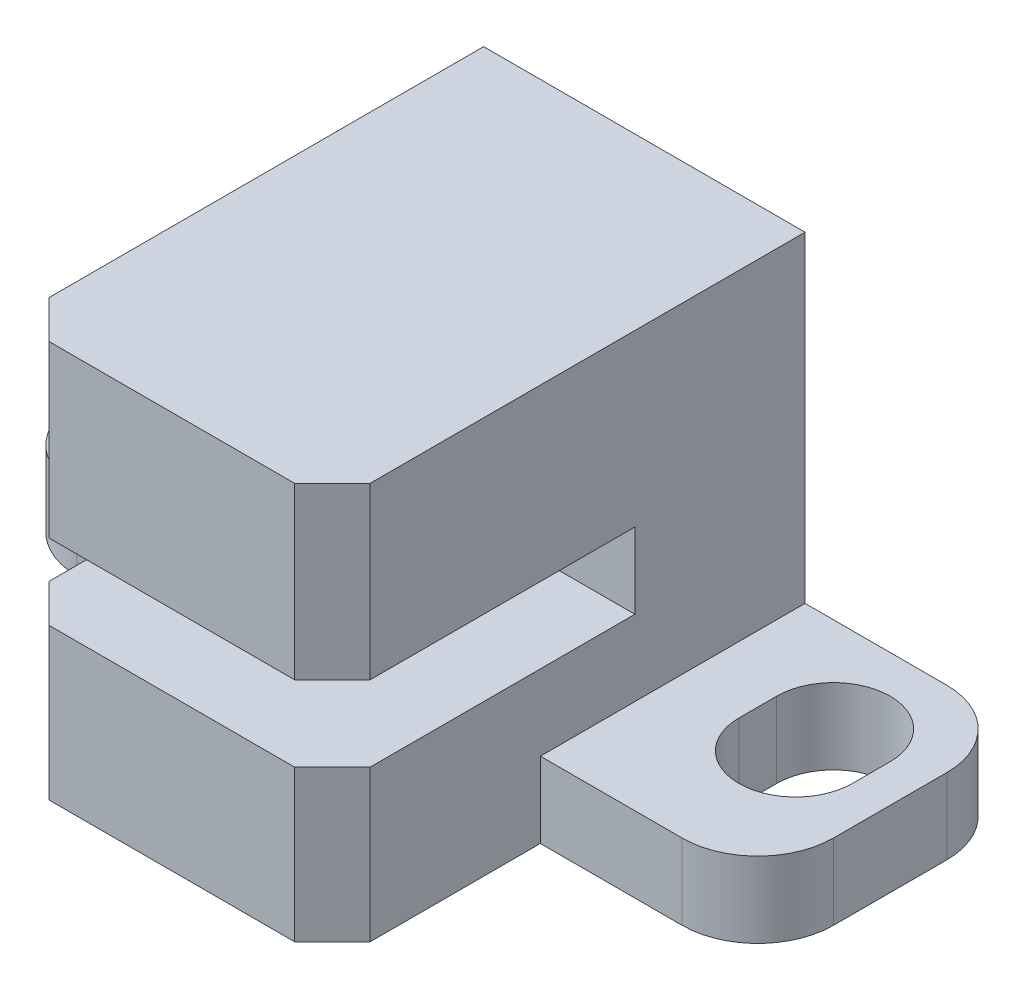
ISO-10303-21;
HEADER;
FILE_DESCRIPTION(('STEP AP214'),'2;1');
FILE_NAME('part.step','',(''),(''),'','','');
FILE_SCHEMA(('AUTOMOTIVE_DESIGN { 1 0 10303 214 1 1 1 1 }'));
ENDSEC;
DATA;
#1=APPLICATION_CONTEXT('core data for automotive mechanical design processes');
#2=APPLICATION_PROTOCOL_DEFINITION('international standard','automotive_design',2000,#1);
#3=PRODUCT_CONTEXT('',#1,'mechanical');
#4=PRODUCT('Part','Part','',(#3));
#5=PRODUCT_RELATED_PRODUCT_CATEGORY('part','',(#4));
#6=PRODUCT_DEFINITION_FORMATION('','',#4);
#7=PRODUCT_DEFINITION_CONTEXT('part definition',#1,'design');
#8=PRODUCT_DEFINITION('design','',#6,#7);
#9=PRODUCT_DEFINITION_SHAPE('','',#8);
#10=(LENGTH_UNIT() NAMED_UNIT(*) SI_UNIT(.MILLI.,.METRE.));
#11=(NAMED_UNIT(*) PLANE_ANGLE_UNIT() SI_UNIT($,.RADIAN.));
#12=(NAMED_UNIT(*) SI_UNIT($,.STERADIAN.) SOLID_ANGLE_UNIT());
#13=UNCERTAINTY_MEASURE_WITH_UNIT(LENGTH_MEASURE(1.E-05),#10,'distance_accuracy_value','');
#14=(GEOMETRIC_REPRESENTATION_CONTEXT(3) GLOBAL_UNCERTAINTY_ASSIGNED_CONTEXT((#13)) GLOBAL_UNIT_ASSIGNED_CONTEXT((#10,
#11,#12)) REPRESENTATION_CONTEXT('',''));
#15=CARTESIAN_POINT('',(0.,0.,0.));
#16=DIRECTION('',(0.,0.,1.));
#17=DIRECTION('',(1.,0.,0.));
#18=AXIS2_PLACEMENT_3D('',#15,#16,#17);
#19=CARTESIAN_POINT('',(4.25,5.25,12.5));
#20=DIRECTION('',(-1.,0.,0.));
#21=DIRECTION('',(0.,-1.,0.));
#22=AXIS2_PLACEMENT_3D('',#19,#20,#21);
#23=PLANE('',#22);
#24=DIRECTION('',(0.,0.,1.));
#25=VECTOR('',#24,1.);
#26=CARTESIAN_POINT('',(4.25,-1.25,4.5));
#27=LINE('',#26,#25);
#28=CARTESIAN_POINT('',(4.25,-1.25,4.5));
#29=VERTEX_POINT('',#28);
#30=CARTESIAN_POINT('',(4.25,-1.25,11.5));
#31=VERTEX_POINT('',#30);
#32=EDGE_CURVE('E414',#29,#31,#27,.T.);
#33=ORIENTED_EDGE('',*,*,#32,.T.);
#34=DIRECTION('',(0.,-1.,0.));
#35=VECTOR('',#34,1.);
#36=CARTESIAN_POINT('',(4.25,-5.25,11.5));
#37=LINE('',#36,#35);
#38=CARTESIAN_POINT('',(4.25,-5.25,11.5));
#39=VERTEX_POINT('',#38);
#40=EDGE_CURVE('E455',#31,#39,#37,.T.);
#41=ORIENTED_EDGE('',*,*,#40,.T.);
#42=DIRECTION('',(0.,0.,-1.));
#43=VECTOR('',#42,1.);
#44=CARTESIAN_POINT('',(4.25,-5.25,12.5));
#45=LINE('',#44,#43);
#46=CARTESIAN_POINT('',(4.25,-5.25,7.));
#47=VERTEX_POINT('',#46);
#48=EDGE_CURVE('E426',#39,#47,#45,.T.);
#49=ORIENTED_EDGE('',*,*,#48,.T.);
#50=DIRECTION('',(0.,-1.,0.));
#51=VECTOR('',#50,1.);
#52=CARTESIAN_POINT('',(4.25,-3.25,7.));
#53=LINE('',#52,#51);
#54=CARTESIAN_POINT('',(4.25,-3.25,7.));
#55=VERTEX_POINT('',#54);
#56=EDGE_CURVE('E380',#55,#47,#53,.T.);
#57=ORIENTED_EDGE('',*,*,#56,.F.);
#58=DIRECTION('',(0.,0.,-1.));
#59=VECTOR('',#58,1.);
#60=CARTESIAN_POINT('',(4.25,-3.25,0.));
#61=LINE('',#60,#59);
#62=CARTESIAN_POINT('',(4.25,-3.25,0.));
#63=VERTEX_POINT('',#62);
#64=EDGE_CURVE('E350',#55,#63,#61,.T.);
#65=ORIENTED_EDGE('',*,*,#64,.T.);
#66=DIRECTION('',(0.,1.,0.));
#67=VECTOR('',#66,1.);
#68=CARTESIAN_POINT('',(4.25,5.25,0.));
#69=LINE('',#68,#67);
#70=CARTESIAN_POINT('',(4.25,5.25,0.));
#71=VERTEX_POINT('',#70);
#72=EDGE_CURVE('E410',#63,#71,#69,.T.);
#73=ORIENTED_EDGE('',*,*,#72,.T.);
#74=DIRECTION('',(0.,0.,-1.));
#75=VECTOR('',#74,1.);
#76=CARTESIAN_POINT('',(4.25,5.25,12.5));
#77=LINE('',#76,#75);
#78=CARTESIAN_POINT('',(4.25,5.25,11.5));
#79=VERTEX_POINT('',#78);
#80=EDGE_CURVE('E441',#79,#71,#77,.T.);
#81=ORIENTED_EDGE('',*,*,#80,.F.);
#82=DIRECTION('',(0.,-1.,0.));
#83=VECTOR('',#82,1.);
#84=CARTESIAN_POINT('',(4.25,0.749999999999999,11.5));
#85=LINE('',#84,#83);
#86=CARTESIAN_POINT('',(4.25,0.749999999999999,11.5));
#87=VERTEX_POINT('',#86);
#88=EDGE_CURVE('E453',#79,#87,#85,.T.);
#89=ORIENTED_EDGE('',*,*,#88,.T.);
#90=DIRECTION('',(0.,0.,1.));
#91=VECTOR('',#90,1.);
#92=CARTESIAN_POINT('',(4.25,0.749999999999999,4.5));
#93=LINE('',#92,#91);
#94=CARTESIAN_POINT('',(4.25,0.749999999999999,4.5));
#95=VERTEX_POINT('',#94);
#96=EDGE_CURVE('E411',#95,#87,#93,.T.);
#97=ORIENTED_EDGE('',*,*,#96,.F.);
#98=DIRECTION('',(0.,1.,0.));
#99=VECTOR('',#98,1.);
#100=CARTESIAN_POINT('',(4.25,0.749999999999999,4.5));
#101=LINE('',#100,#99);
#102=EDGE_CURVE('E399',#29,#95,#101,.T.);
#103=ORIENTED_EDGE('',*,*,#102,.F.);
#104=EDGE_LOOP('',(#33,#41,#49,#57,#65,#73,#81,#89,#97,#103));
#105=FACE_BOUND('',#104,.T.);
#106=ADVANCED_FACE('F37',(#105),#23,.F.);
#107=CARTESIAN_POINT('',(0.,0.,12.5));
#108=DIRECTION('',(0.,0.,1.));
#109=DIRECTION('',(1.,0.,0.));
#110=AXIS2_PLACEMENT_3D('',#107,#108,#109);
#111=PLANE('',#110);
#112=DIRECTION('',(-1.,0.,0.));
#113=VECTOR('',#112,1.);
#114=CARTESIAN_POINT('',(-4.25,0.749999999999999,12.5));
#115=LINE('',#114,#113);
#116=CARTESIAN_POINT('',(3.25,0.749999999999999,12.5));
#117=VERTEX_POINT('',#116);
#118=CARTESIAN_POINT('',(-3.25,0.749999999999999,12.5));
#119=VERTEX_POINT('',#118);
#120=EDGE_CURVE('E396',#117,#119,#115,.T.);
#121=ORIENTED_EDGE('',*,*,#120,.F.);
#122=DIRECTION('',(0.,1.,0.));
#123=VECTOR('',#122,1.);
#124=CARTESIAN_POINT('',(3.25,5.25,12.5));
#125=LINE('',#124,#123);
#126=CARTESIAN_POINT('',(3.25,5.25,12.5));
#127=VERTEX_POINT('',#126);
#128=EDGE_CURVE('E464',#117,#127,#125,.T.);
#129=ORIENTED_EDGE('',*,*,#128,.T.);
#130=DIRECTION('',(-1.,0.,0.));
#131=VECTOR('',#130,1.);
#132=CARTESIAN_POINT('',(-4.25,5.25,12.5));
#133=LINE('',#132,#131);
#134=CARTESIAN_POINT('',(-3.25,5.25,12.5));
#135=VERTEX_POINT('',#134);
#136=EDGE_CURVE('E419',#127,#135,#133,.T.);
#137=ORIENTED_EDGE('',*,*,#136,.T.);
#138=DIRECTION('',(0.,-1.,0.));
#139=VECTOR('',#138,1.);
#140=CARTESIAN_POINT('',(-3.25,0.749999999999999,12.5));
#141=LINE('',#140,#139);
#142=EDGE_CURVE('E461',#135,#119,#141,.T.);
#143=ORIENTED_EDGE('',*,*,#142,.T.);
#144=EDGE_LOOP('',(#121,#129,#137,#143));
#145=FACE_BOUND('',#144,.T.);
#146=ADVANCED_FACE('F482',(#145),#111,.T.);
#147=CARTESIAN_POINT('',(-4.25,5.25,12.5));
#148=DIRECTION('',(0.,-1.,0.));
#149=DIRECTION('',(0.,0.,-1.));
#150=AXIS2_PLACEMENT_3D('',#147,#148,#149);
#151=PLANE('',#150);
#152=ORIENTED_EDGE('',*,*,#136,.F.);
#153=DIRECTION('',(0.707106781186546,0.,-0.707106781186549));
#154=VECTOR('',#153,1.);
#155=CARTESIAN_POINT('',(3.25,5.25,12.5));
#156=LINE('',#155,#154);
#157=EDGE_CURVE('E469',#127,#79,#156,.T.);
#158=ORIENTED_EDGE('',*,*,#157,.T.);
#159=ORIENTED_EDGE('',*,*,#80,.T.);
#160=DIRECTION('',(-1.,0.,0.));
#161=VECTOR('',#160,1.);
#162=CARTESIAN_POINT('',(-4.25,5.25,0.));
#163=LINE('',#162,#161);
#164=CARTESIAN_POINT('',(-4.25,5.25,0.));
#165=VERTEX_POINT('',#164);
#166=EDGE_CURVE('E429',#71,#165,#163,.T.);
#167=ORIENTED_EDGE('',*,*,#166,.T.);
#168=DIRECTION('',(0.,0.,-1.));
#169=VECTOR('',#168,1.);
#170=CARTESIAN_POINT('',(-4.25,5.25,12.5));
#171=LINE('',#170,#169);
#172=CARTESIAN_POINT('',(-4.25,5.25,11.5));
#173=VERTEX_POINT('',#172);
#174=EDGE_CURVE('E439',#173,#165,#171,.T.);
#175=ORIENTED_EDGE('',*,*,#174,.F.);
#176=DIRECTION('',(0.707106781186546,0.,0.707106781186549));
#177=VECTOR('',#176,1.);
#178=CARTESIAN_POINT('',(-3.25,5.25,12.5));
#179=LINE('',#178,#177);
#180=EDGE_CURVE('E467',#173,#135,#179,.T.);
#181=ORIENTED_EDGE('',*,*,#180,.T.);
#182=EDGE_LOOP('',(#152,#158,#159,#167,#175,#181));
#183=FACE_BOUND('',#182,.T.);
#184=ADVANCED_FACE('F488',(#183),#151,.F.);
#185=CARTESIAN_POINT('',(-4.25,5.25,12.5));
#186=DIRECTION('',(1.,0.,0.));
#187=DIRECTION('',(0.,1.,0.));
#188=AXIS2_PLACEMENT_3D('',#185,#186,#187);
#189=PLANE('',#188);
#190=DIRECTION('',(0.,0.,-1.));
#191=VECTOR('',#190,1.);
#192=CARTESIAN_POINT('',(-4.25,-5.25,12.5));
#193=LINE('',#192,#191);
#194=CARTESIAN_POINT('',(-4.25,-5.25,11.5));
#195=VERTEX_POINT('',#194);
#196=CARTESIAN_POINT('',(-4.25,-5.25,7.));
#197=VERTEX_POINT('',#196);
#198=EDGE_CURVE('E437',#195,#197,#193,.T.);
#199=ORIENTED_EDGE('',*,*,#198,.F.);
#200=DIRECTION('',(0.,1.,0.));
#201=VECTOR('',#200,1.);
#202=CARTESIAN_POINT('',(-4.25,-1.25,11.5));
#203=LINE('',#202,#201);
#204=CARTESIAN_POINT('',(-4.25,-1.25,11.5));
#205=VERTEX_POINT('',#204);
#206=EDGE_CURVE('E11',#195,#205,#203,.T.);
#207=ORIENTED_EDGE('',*,*,#206,.T.);
#208=DIRECTION('',(0.,0.,1.));
#209=VECTOR('',#208,1.);
#210=CARTESIAN_POINT('',(-4.25,-1.25,4.5));
#211=LINE('',#210,#209);
#212=CARTESIAN_POINT('',(-4.25,-1.25,4.5));
#213=VERTEX_POINT('',#212);
#214=EDGE_CURVE('E404',#213,#205,#211,.T.);
#215=ORIENTED_EDGE('',*,*,#214,.F.);
#216=DIRECTION('',(0.,-1.,0.));
#217=VECTOR('',#216,1.);
#218=CARTESIAN_POINT('',(-4.25,0.749999999999999,4.5));
#219=LINE('',#218,#217);
#220=CARTESIAN_POINT('',(-4.25,0.749999999999999,4.5));
#221=VERTEX_POINT('',#220);
#222=EDGE_CURVE('E392',#221,#213,#219,.T.);
#223=ORIENTED_EDGE('',*,*,#222,.F.);
#224=DIRECTION('',(0.,0.,1.));
#225=VECTOR('',#224,1.);
#226=CARTESIAN_POINT('',(-4.25,0.749999999999999,4.5));
#227=LINE('',#226,#225);
#228=CARTESIAN_POINT('',(-4.25,0.749999999999999,11.5));
#229=VERTEX_POINT('',#228);
#230=EDGE_CURVE('E408',#221,#229,#227,.T.);
#231=ORIENTED_EDGE('',*,*,#230,.T.);
#232=DIRECTION('',(0.,1.,0.));
#233=VECTOR('',#232,1.);
#234=CARTESIAN_POINT('',(-4.25,5.25,11.5));
#235=LINE('',#234,#233);
#236=EDGE_CURVE('E45',#229,#173,#235,.T.);
#237=ORIENTED_EDGE('',*,*,#236,.T.);
#238=ORIENTED_EDGE('',*,*,#174,.T.);
#239=DIRECTION('',(0.,-1.,0.));
#240=VECTOR('',#239,1.);
#241=CARTESIAN_POINT('',(-4.25,5.25,0.));
#242=LINE('',#241,#240);
#243=CARTESIAN_POINT('',(-4.25,-3.25,0.));
#244=VERTEX_POINT('',#243);
#245=EDGE_CURVE('E432',#165,#244,#242,.T.);
#246=ORIENTED_EDGE('',*,*,#245,.T.);
#247=DIRECTION('',(0.,0.,1.));
#248=VECTOR('',#247,1.);
#249=CARTESIAN_POINT('',(-4.25,-3.25,0.));
#250=LINE('',#249,#248);
#251=CARTESIAN_POINT('',(-4.25,-3.25,7.));
#252=VERTEX_POINT('',#251);
#253=EDGE_CURVE('E276',#244,#252,#250,.T.);
#254=ORIENTED_EDGE('',*,*,#253,.T.);
#255=DIRECTION('',(0.,-1.,0.));
#256=VECTOR('',#255,1.);
#257=CARTESIAN_POINT('',(-4.25,-3.25,7.));
#258=LINE('',#257,#256);
#259=EDGE_CURVE('E295',#252,#197,#258,.T.);
#260=ORIENTED_EDGE('',*,*,#259,.T.);
#261=EDGE_LOOP('',(#199,#207,#215,#223,#231,#237,#238,#246,#254,#260));
#262=FACE_BOUND('',#261,.T.);
#263=ADVANCED_FACE('F770',(#262),#189,.F.);
#264=CARTESIAN_POINT('',(-4.25,-5.25,12.5));
#265=DIRECTION('',(0.,1.,0.));
#266=DIRECTION('',(0.,0.,1.));
#267=AXIS2_PLACEMENT_3D('',#264,#265,#266);
#268=PLANE('',#267);
#269=ORIENTED_EDGE('',*,*,#48,.F.);
#270=DIRECTION('',(-0.707106781186546,0.,0.707106781186549));
#271=VECTOR('',#270,1.);
#272=CARTESIAN_POINT('',(3.25,-5.25,12.5));
#273=LINE('',#272,#271);
#274=CARTESIAN_POINT('',(3.25000000000001,-5.25,12.5));
#275=VERTEX_POINT('',#274);
#276=EDGE_CURVE('E459',#39,#275,#273,.T.);
#277=ORIENTED_EDGE('',*,*,#276,.T.);
#278=DIRECTION('',(1.,0.,0.));
#279=VECTOR('',#278,1.);
#280=CARTESIAN_POINT('',(-4.25,-5.25,12.5));
#281=LINE('',#280,#279);
#282=CARTESIAN_POINT('',(-3.25,-5.25,12.5));
#283=VERTEX_POINT('',#282);
#284=EDGE_CURVE('E422',#283,#275,#281,.T.);
#285=ORIENTED_EDGE('',*,*,#284,.F.);
#286=DIRECTION('',(-0.707106781186546,0.,-0.707106781186549));
#287=VECTOR('',#286,1.);
#288=CARTESIAN_POINT('',(-3.25,-5.25,12.5));
#289=LINE('',#288,#287);
#290=EDGE_CURVE('E457',#283,#195,#289,.T.);
#291=ORIENTED_EDGE('',*,*,#290,.T.);
#292=ORIENTED_EDGE('',*,*,#198,.T.);
#293=DIRECTION('',(-1.,0.,0.));
#294=VECTOR('',#293,1.);
#295=CARTESIAN_POINT('',(-4.25,-5.25,7.));
#296=LINE('',#295,#294);
#297=CARTESIAN_POINT('',(-7.99999999999998,-5.25,7.));
#298=VERTEX_POINT('',#297);
#299=EDGE_CURVE('E272',#197,#298,#296,.T.);
#300=ORIENTED_EDGE('',*,*,#299,.T.);
#301=CARTESIAN_POINT('',(-8.,-5.25,5.));
#302=DIRECTION('',(0.,-1.,0.));
#303=DIRECTION('',(0.,0.,-1.));
#304=AXIS2_PLACEMENT_3D('',#301,#302,#303);
#305=CIRCLE('',#304,2.);
#306=CARTESIAN_POINT('',(-10.,-5.25,4.99999999999999));
#307=VERTEX_POINT('',#306);
#308=EDGE_CURVE('E298',#298,#307,#305,.T.);
#309=ORIENTED_EDGE('',*,*,#308,.T.);
#310=DIRECTION('',(0.,0.,-1.));
#311=VECTOR('',#310,1.);
#312=CARTESIAN_POINT('',(-10.,-5.25,2.00000000000001));
#313=LINE('',#312,#311);
#314=CARTESIAN_POINT('',(-10.,-5.25,2.00000000000001));
#315=VERTEX_POINT('',#314);
#316=EDGE_CURVE('E301',#307,#315,#313,.T.);
#317=ORIENTED_EDGE('',*,*,#316,.T.);
#318=CARTESIAN_POINT('',(-8.,-5.25,2.));
#319=DIRECTION('',(0.,-1.,0.));
#320=DIRECTION('',(0.,0.,1.));
#321=AXIS2_PLACEMENT_3D('',#318,#319,#320);
#322=CIRCLE('',#321,2.);
#323=CARTESIAN_POINT('',(-7.99999999999998,-5.25,0.));
#324=VERTEX_POINT('',#323);
#325=EDGE_CURVE('E280',#315,#324,#322,.T.);
#326=ORIENTED_EDGE('',*,*,#325,.T.);
#327=DIRECTION('',(1.,0.,0.));
#328=VECTOR('',#327,1.);
#329=CARTESIAN_POINT('',(-4.25,-5.25,0.));
#330=LINE('',#329,#328);
#331=CARTESIAN_POINT('',(7.99999999999999,-5.25,0.));
#332=VERTEX_POINT('',#331);
#333=EDGE_CURVE('E423',#324,#332,#330,.T.);
#334=ORIENTED_EDGE('',*,*,#333,.T.);
#335=CARTESIAN_POINT('',(8.,-5.25,2.));
#336=DIRECTION('',(0.,-1.,0.));
#337=DIRECTION('',(0.,0.,1.));
#338=AXIS2_PLACEMENT_3D('',#335,#336,#337);
#339=CIRCLE('',#338,2.);
#340=CARTESIAN_POINT('',(10.,-5.25,2.00000000000001));
#341=VERTEX_POINT('',#340);
#342=EDGE_CURVE('E343',#332,#341,#339,.T.);
#343=ORIENTED_EDGE('',*,*,#342,.T.);
#344=DIRECTION('',(0.,0.,1.));
#345=VECTOR('',#344,1.);
#346=CARTESIAN_POINT('',(10.,-5.25,2.00000000000001));
#347=LINE('',#346,#345);
#348=CARTESIAN_POINT('',(10.,-5.25,4.99999999999999));
#349=VERTEX_POINT('',#348);
#350=EDGE_CURVE('E372',#341,#349,#347,.T.);
#351=ORIENTED_EDGE('',*,*,#350,.T.);
#352=CARTESIAN_POINT('',(8.,-5.25,5.));
#353=DIRECTION('',(0.,-1.,0.));
#354=DIRECTION('',(0.,0.,1.));
#355=AXIS2_PLACEMENT_3D('',#352,#353,#354);
#356=CIRCLE('',#355,2.);
#357=CARTESIAN_POINT('',(7.99999999999999,-5.25,7.));
#358=VERTEX_POINT('',#357);
#359=EDGE_CURVE('E375',#349,#358,#356,.T.);
#360=ORIENTED_EDGE('',*,*,#359,.T.);
#361=DIRECTION('',(-1.,0.,0.));
#362=VECTOR('',#361,1.);
#363=CARTESIAN_POINT('',(4.25,-5.25,7.));
#364=LINE('',#363,#362);
#365=EDGE_CURVE('E354',#358,#47,#364,.T.);
#366=ORIENTED_EDGE('',*,*,#365,.T.);
#367=EDGE_LOOP('',(#269,#277,#285,#291,#292,#300,#309,#317,#326,#334,#343,#351,#360,#366));
#368=FACE_BOUND('',#367,.T.);
#369=DIRECTION('',(0.,0.,1.));
#370=VECTOR('',#369,1.);
#371=CARTESIAN_POINT('',(9.,-5.25,2.5));
#372=LINE('',#371,#370);
#373=CARTESIAN_POINT('',(9.,-5.25,2.5));
#374=VERTEX_POINT('',#373);
#375=CARTESIAN_POINT('',(9.,-5.25,3.5));
#376=VERTEX_POINT('',#375);
#377=EDGE_CURVE('E333',#374,#376,#372,.T.);
#378=ORIENTED_EDGE('',*,*,#377,.F.);
#379=CARTESIAN_POINT('',(7.5,-5.25,2.5));
#380=DIRECTION('',(0.,-1.,0.));
#381=DIRECTION('',(0.,0.,-1.));
#382=AXIS2_PLACEMENT_3D('',#379,#380,#381);
#383=CIRCLE('',#382,1.5);
#384=CARTESIAN_POINT('',(6.,-5.25,2.5));
#385=VERTEX_POINT('',#384);
#386=EDGE_CURVE('E309',#385,#374,#383,.T.);
#387=ORIENTED_EDGE('',*,*,#386,.F.);
#388=DIRECTION('',(0.,0.,-1.));
#389=VECTOR('',#388,1.);
#390=CARTESIAN_POINT('',(6.,-5.25,2.5));
#391=LINE('',#390,#389);
#392=CARTESIAN_POINT('',(6.,-5.25,3.5));
#393=VERTEX_POINT('',#392);
#394=EDGE_CURVE('E322',#393,#385,#391,.T.);
#395=ORIENTED_EDGE('',*,*,#394,.F.);
#396=CARTESIAN_POINT('',(7.5,-5.25,3.5));
#397=DIRECTION('',(0.,-1.,0.));
#398=DIRECTION('',(0.,0.,-1.));
#399=AXIS2_PLACEMENT_3D('',#396,#397,#398);
#400=CIRCLE('',#399,1.5);
#401=EDGE_CURVE('E336',#376,#393,#400,.T.);
#402=ORIENTED_EDGE('',*,*,#401,.F.);
#403=EDGE_LOOP('',(#378,#387,#395,#402));
#404=FACE_BOUND('',#403,.T.);
#405=CARTESIAN_POINT('',(-7.5,-5.25,2.5));
#406=DIRECTION('',(0.,-1.,0.));
#407=DIRECTION('',(0.,0.,1.));
#408=AXIS2_PLACEMENT_3D('',#405,#406,#407);
#409=CIRCLE('',#408,1.5);
#410=CARTESIAN_POINT('',(-9.,-5.25,2.5));
#411=VERTEX_POINT('',#410);
#412=CARTESIAN_POINT('',(-6.,-5.25,2.5));
#413=VERTEX_POINT('',#412);
#414=EDGE_CURVE('E239',#411,#413,#409,.T.);
#415=ORIENTED_EDGE('',*,*,#414,.F.);
#416=DIRECTION('',(0.,0.,-1.));
#417=VECTOR('',#416,1.);
#418=CARTESIAN_POINT('',(-9.,-5.25,2.5));
#419=LINE('',#418,#417);
#420=CARTESIAN_POINT('',(-9.,-5.25,3.5));
#421=VERTEX_POINT('',#420);
#422=EDGE_CURVE('E257',#421,#411,#419,.T.);
#423=ORIENTED_EDGE('',*,*,#422,.F.);
#424=CARTESIAN_POINT('',(-7.5,-5.25,3.5));
#425=DIRECTION('',(0.,-1.,0.));
#426=DIRECTION('',(0.,0.,1.));
#427=AXIS2_PLACEMENT_3D('',#424,#425,#426);
#428=CIRCLE('',#427,1.5);
#429=CARTESIAN_POINT('',(-6.,-5.25,3.5));
#430=VERTEX_POINT('',#429);
#431=EDGE_CURVE('E260',#430,#421,#428,.T.);
#432=ORIENTED_EDGE('',*,*,#431,.F.);
#433=DIRECTION('',(0.,0.,1.));
#434=VECTOR('',#433,1.);
#435=CARTESIAN_POINT('',(-6.,-5.25,2.5));
#436=LINE('',#435,#434);
#437=EDGE_CURVE('E266',#413,#430,#436,.T.);
#438=ORIENTED_EDGE('',*,*,#437,.F.);
#439=EDGE_LOOP('',(#415,#423,#432,#438));
#440=FACE_BOUND('',#439,.T.);
#441=ADVANCED_FACE('F761',(#368,#404,#440),#268,.F.);
#442=ORIENTED_EDGE('',*,*,#284,.T.);
#443=DIRECTION('',(0.,1.,0.));
#444=VECTOR('',#443,1.);
#445=CARTESIAN_POINT('',(3.25,-1.25,12.5));
#446=LINE('',#445,#444);
#447=CARTESIAN_POINT('',(3.25,-1.25,12.5));
#448=VERTEX_POINT('',#447);
#449=EDGE_CURVE('E446',#275,#448,#446,.T.);
#450=ORIENTED_EDGE('',*,*,#449,.T.);
#451=DIRECTION('',(1.,0.,0.));
#452=VECTOR('',#451,1.);
#453=CARTESIAN_POINT('',(-4.25,-1.25,12.5));
#454=LINE('',#453,#452);
#455=CARTESIAN_POINT('',(-3.25,-1.25,12.5));
#456=VERTEX_POINT('',#455);
#457=EDGE_CURVE('E383',#456,#448,#454,.T.);
#458=ORIENTED_EDGE('',*,*,#457,.F.);
#459=DIRECTION('',(0.,-1.,0.));
#460=VECTOR('',#459,1.);
#461=CARTESIAN_POINT('',(-3.25,-5.25,12.5));
#462=LINE('',#461,#460);
#463=EDGE_CURVE('E443',#456,#283,#462,.T.);
#464=ORIENTED_EDGE('',*,*,#463,.T.);
#465=EDGE_LOOP('',(#442,#450,#458,#464));
#466=FACE_BOUND('',#465,.T.);
#467=ADVANCED_FACE('F510',(#466),#111,.T.);
#468=CARTESIAN_POINT('',(0.,0.,0.));
#469=DIRECTION('',(0.,0.,1.));
#470=DIRECTION('',(1.,0.,0.));
#471=AXIS2_PLACEMENT_3D('',#468,#469,#470);
#472=PLANE('',#471);
#473=ORIENTED_EDGE('',*,*,#72,.F.);
#474=DIRECTION('',(1.,0.,0.));
#475=VECTOR('',#474,1.);
#476=CARTESIAN_POINT('',(4.25,-3.25,0.));
#477=LINE('',#476,#475);
#478=CARTESIAN_POINT('',(7.99999999999999,-3.25,0.));
#479=VERTEX_POINT('',#478);
#480=EDGE_CURVE('E353',#63,#479,#477,.T.);
#481=ORIENTED_EDGE('',*,*,#480,.T.);
#482=DIRECTION('',(0.,-1.,0.));
#483=VECTOR('',#482,1.);
#484=CARTESIAN_POINT('',(7.99999999999999,-3.25,0.));
#485=LINE('',#484,#483);
#486=EDGE_CURVE('E369',#479,#332,#485,.T.);
#487=ORIENTED_EDGE('',*,*,#486,.T.);
#488=ORIENTED_EDGE('',*,*,#333,.F.);
#489=DIRECTION('',(0.,-1.,0.));
#490=VECTOR('',#489,1.);
#491=CARTESIAN_POINT('',(-7.99999999999998,-3.25,0.));
#492=LINE('',#491,#490);
#493=CARTESIAN_POINT('',(-7.99999999999998,-3.25,0.));
#494=VERTEX_POINT('',#493);
#495=EDGE_CURVE('E306',#494,#324,#492,.T.);
#496=ORIENTED_EDGE('',*,*,#495,.F.);
#497=DIRECTION('',(1.,0.,0.));
#498=VECTOR('',#497,1.);
#499=CARTESIAN_POINT('',(-4.25,-3.25,0.));
#500=LINE('',#499,#498);
#501=EDGE_CURVE('E292',#494,#244,#500,.T.);
#502=ORIENTED_EDGE('',*,*,#501,.T.);
#503=ORIENTED_EDGE('',*,*,#245,.F.);
#504=ORIENTED_EDGE('',*,*,#166,.F.);
#505=EDGE_LOOP('',(#473,#481,#487,#488,#496,#502,#503,#504));
#506=FACE_BOUND('',#505,.T.);
#507=ADVANCED_FACE('F495',(#506),#472,.F.);
#508=CARTESIAN_POINT('',(-4.25,0.749999999999999,4.5));
#509=DIRECTION('',(0.,1.,0.));
#510=DIRECTION('',(0.,0.,1.));
#511=AXIS2_PLACEMENT_3D('',#508,#509,#510);
#512=PLANE('',#511);
#513=ORIENTED_EDGE('',*,*,#96,.T.);
#514=DIRECTION('',(-0.707106781186546,0.,0.707106781186549));
#515=VECTOR('',#514,1.);
#516=CARTESIAN_POINT('',(3.25,0.749999999999999,12.5));
#517=LINE('',#516,#515);
#518=EDGE_CURVE('E472',#87,#117,#517,.T.);
#519=ORIENTED_EDGE('',*,*,#518,.T.);
#520=ORIENTED_EDGE('',*,*,#120,.T.);
#521=DIRECTION('',(-0.707106781186546,0.,-0.707106781186549));
#522=VECTOR('',#521,1.);
#523=CARTESIAN_POINT('',(-3.25,0.749999999999999,12.5));
#524=LINE('',#523,#522);
#525=EDGE_CURVE('E52',#119,#229,#524,.T.);
#526=ORIENTED_EDGE('',*,*,#525,.T.);
#527=ORIENTED_EDGE('',*,*,#230,.F.);
#528=DIRECTION('',(-1.,0.,0.));
#529=VECTOR('',#528,1.);
#530=CARTESIAN_POINT('',(-4.25,0.749999999999999,4.5));
#531=LINE('',#530,#529);
#532=EDGE_CURVE('E401',#95,#221,#531,.T.);
#533=ORIENTED_EDGE('',*,*,#532,.F.);
#534=EDGE_LOOP('',(#513,#519,#520,#526,#527,#533));
#535=FACE_BOUND('',#534,.T.);
#536=ADVANCED_FACE('F475',(#535),#512,.F.);
#537=CARTESIAN_POINT('',(-4.25,-1.25,4.5));
#538=DIRECTION('',(0.,-1.,0.));
#539=DIRECTION('',(1.,0.,0.));
#540=AXIS2_PLACEMENT_3D('',#537,#538,#539);
#541=PLANE('',#540);
#542=ORIENTED_EDGE('',*,*,#457,.T.);
#543=DIRECTION('',(0.707106781186546,0.,-0.707106781186549));
#544=VECTOR('',#543,1.);
#545=CARTESIAN_POINT('',(3.25,-1.25,12.5));
#546=LINE('',#545,#544);
#547=EDGE_CURVE('E451',#448,#31,#546,.T.);
#548=ORIENTED_EDGE('',*,*,#547,.T.);
#549=ORIENTED_EDGE('',*,*,#32,.F.);
#550=DIRECTION('',(1.,0.,0.));
#551=VECTOR('',#550,1.);
#552=CARTESIAN_POINT('',(-4.25,-1.25,4.5));
#553=LINE('',#552,#551);
#554=EDGE_CURVE('E395',#213,#29,#553,.T.);
#555=ORIENTED_EDGE('',*,*,#554,.F.);
#556=ORIENTED_EDGE('',*,*,#214,.T.);
#557=DIRECTION('',(0.707106781186546,0.,0.707106781186549));
#558=VECTOR('',#557,1.);
#559=CARTESIAN_POINT('',(-3.25,-1.25,12.5));
#560=LINE('',#559,#558);
#561=EDGE_CURVE('E449',#205,#456,#560,.T.);
#562=ORIENTED_EDGE('',*,*,#561,.T.);
#563=EDGE_LOOP('',(#542,#548,#549,#555,#556,#562));
#564=FACE_BOUND('',#563,.T.);
#565=ADVANCED_FACE('F718',(#564),#541,.F.);
#566=CARTESIAN_POINT('',(0.,0.,4.5));
#567=DIRECTION('',(0.,0.,1.));
#568=DIRECTION('',(1.,0.,0.));
#569=AXIS2_PLACEMENT_3D('',#566,#567,#568);
#570=PLANE('',#569);
#571=ORIENTED_EDGE('',*,*,#222,.T.);
#572=ORIENTED_EDGE('',*,*,#554,.T.);
#573=ORIENTED_EDGE('',*,*,#102,.T.);
#574=ORIENTED_EDGE('',*,*,#532,.T.);
#575=EDGE_LOOP('',(#571,#572,#573,#574));
#576=FACE_BOUND('',#575,.T.);
#577=ADVANCED_FACE('F696',(#576),#570,.T.);
#578=CARTESIAN_POINT('',(4.25,-3.25,7.));
#579=DIRECTION('',(0.,0.,1.));
#580=DIRECTION('',(1.,0.,0.));
#581=AXIS2_PLACEMENT_3D('',#578,#579,#580);
#582=PLANE('',#581);
#583=ORIENTED_EDGE('',*,*,#365,.F.);
#584=DIRECTION('',(0.,-1.,0.));
#585=VECTOR('',#584,1.);
#586=CARTESIAN_POINT('',(7.99999999999999,-3.25,7.));
#587=LINE('',#586,#585);
#588=CARTESIAN_POINT('',(7.99999999999999,-3.25,7.));
#589=VERTEX_POINT('',#588);
#590=EDGE_CURVE('E384',#589,#358,#587,.T.);
#591=ORIENTED_EDGE('',*,*,#590,.F.);
#592=DIRECTION('',(-1.,0.,0.));
#593=VECTOR('',#592,1.);
#594=CARTESIAN_POINT('',(4.25,-3.25,7.));
#595=LINE('',#594,#593);
#596=EDGE_CURVE('E366',#589,#55,#595,.T.);
#597=ORIENTED_EDGE('',*,*,#596,.T.);
#598=ORIENTED_EDGE('',*,*,#56,.T.);
#599=EDGE_LOOP('',(#583,#591,#597,#598));
#600=FACE_BOUND('',#599,.T.);
#601=ADVANCED_FACE('F687',(#600),#582,.T.);
#602=CARTESIAN_POINT('',(8.,-3.25,5.));
#603=DIRECTION('',(0.,-1.,0.));
#604=DIRECTION('',(0.,0.,-1.));
#605=AXIS2_PLACEMENT_3D('',#602,#603,#604);
#606=CYLINDRICAL_SURFACE('',#605,2.);
#607=ORIENTED_EDGE('',*,*,#359,.F.);
#608=DIRECTION('',(0.,-1.,0.));
#609=VECTOR('',#608,1.);
#610=CARTESIAN_POINT('',(10.,-3.25,4.99999999999999));
#611=LINE('',#610,#609);
#612=CARTESIAN_POINT('',(10.,-3.25,4.99999999999999));
#613=VERTEX_POINT('',#612);
#614=EDGE_CURVE('E386',#613,#349,#611,.T.);
#615=ORIENTED_EDGE('',*,*,#614,.F.);
#616=CARTESIAN_POINT('',(8.,-3.25,5.));
#617=DIRECTION('',(0.,-1.,0.));
#618=DIRECTION('',(0.,0.,1.));
#619=AXIS2_PLACEMENT_3D('',#616,#617,#618);
#620=CIRCLE('',#619,2.);
#621=EDGE_CURVE('E363',#613,#589,#620,.T.);
#622=ORIENTED_EDGE('',*,*,#621,.T.);
#623=ORIENTED_EDGE('',*,*,#590,.T.);
#624=EDGE_LOOP('',(#607,#615,#622,#623));
#625=FACE_BOUND('',#624,.T.);
#626=ADVANCED_FACE('F678',(#625),#606,.T.);
#627=CARTESIAN_POINT('',(10.,-3.25,2.00000000000001));
#628=DIRECTION('',(1.,0.,0.));
#629=DIRECTION('',(0.,0.,-1.));
#630=AXIS2_PLACEMENT_3D('',#627,#628,#629);
#631=PLANE('',#630);
#632=ORIENTED_EDGE('',*,*,#350,.F.);
#633=DIRECTION('',(0.,-1.,0.));
#634=VECTOR('',#633,1.);
#635=CARTESIAN_POINT('',(10.,-3.25,2.00000000000001));
#636=LINE('',#635,#634);
#637=CARTESIAN_POINT('',(10.,-3.25,2.00000000000001));
#638=VERTEX_POINT('',#637);
#639=EDGE_CURVE('E388',#638,#341,#636,.T.);
#640=ORIENTED_EDGE('',*,*,#639,.F.);
#641=DIRECTION('',(0.,0.,1.));
#642=VECTOR('',#641,1.);
#643=CARTESIAN_POINT('',(10.,-3.25,2.00000000000001));
#644=LINE('',#643,#642);
#645=EDGE_CURVE('E360',#638,#613,#644,.T.);
#646=ORIENTED_EDGE('',*,*,#645,.T.);
#647=ORIENTED_EDGE('',*,*,#614,.T.);
#648=EDGE_LOOP('',(#632,#640,#646,#647));
#649=FACE_BOUND('',#648,.T.);
#650=ADVANCED_FACE('F669',(#649),#631,.T.);
#651=CARTESIAN_POINT('',(8.,-3.25,2.));
#652=DIRECTION('',(0.,-1.,0.));
#653=DIRECTION('',(0.,0.,-1.));
#654=AXIS2_PLACEMENT_3D('',#651,#652,#653);
#655=CYLINDRICAL_SURFACE('',#654,2.);
#656=ORIENTED_EDGE('',*,*,#342,.F.);
#657=ORIENTED_EDGE('',*,*,#486,.F.);
#658=CARTESIAN_POINT('',(8.,-3.25,2.));
#659=DIRECTION('',(0.,-1.,0.));
#660=DIRECTION('',(0.,0.,1.));
#661=AXIS2_PLACEMENT_3D('',#658,#659,#660);
#662=CIRCLE('',#661,2.);
#663=EDGE_CURVE('E357',#479,#638,#662,.T.);
#664=ORIENTED_EDGE('',*,*,#663,.T.);
#665=ORIENTED_EDGE('',*,*,#639,.T.);
#666=EDGE_LOOP('',(#656,#657,#664,#665));
#667=FACE_BOUND('',#666,.T.);
#668=ADVANCED_FACE('F660',(#667),#655,.T.);
#669=CARTESIAN_POINT('',(8.,-3.25,5.));
#670=DIRECTION('',(0.,1.,0.));
#671=DIRECTION('',(0.,0.,1.));
#672=AXIS2_PLACEMENT_3D('',#669,#670,#671);
#673=PLANE('',#672);
#674=CARTESIAN_POINT('',(7.5,-3.25,2.5));
#675=DIRECTION('',(0.,-1.,0.));
#676=DIRECTION('',(0.,0.,-1.));
#677=AXIS2_PLACEMENT_3D('',#674,#675,#676);
#678=CIRCLE('',#677,1.5);
#679=CARTESIAN_POINT('',(6.,-3.25,2.5));
#680=VERTEX_POINT('',#679);
#681=CARTESIAN_POINT('',(9.,-3.25,2.5));
#682=VERTEX_POINT('',#681);
#683=EDGE_CURVE('E318',#680,#682,#678,.T.);
#684=ORIENTED_EDGE('',*,*,#683,.T.);
#685=DIRECTION('',(0.,0.,1.));
#686=VECTOR('',#685,1.);
#687=CARTESIAN_POINT('',(9.,-3.25,2.5));
#688=LINE('',#687,#686);
#689=CARTESIAN_POINT('',(9.,-3.25,3.5));
#690=VERTEX_POINT('',#689);
#691=EDGE_CURVE('E321',#682,#690,#688,.T.);
#692=ORIENTED_EDGE('',*,*,#691,.T.);
#693=CARTESIAN_POINT('',(7.5,-3.25,3.5));
#694=DIRECTION('',(0.,-1.,0.));
#695=DIRECTION('',(0.,0.,-1.));
#696=AXIS2_PLACEMENT_3D('',#693,#694,#695);
#697=CIRCLE('',#696,1.5);
#698=CARTESIAN_POINT('',(6.,-3.25,3.5));
#699=VERTEX_POINT('',#698);
#700=EDGE_CURVE('E325',#690,#699,#697,.T.);
#701=ORIENTED_EDGE('',*,*,#700,.T.);
#702=DIRECTION('',(0.,0.,-1.));
#703=VECTOR('',#702,1.);
#704=CARTESIAN_POINT('',(6.,-3.25,2.5));
#705=LINE('',#704,#703);
#706=EDGE_CURVE('E328',#699,#680,#705,.T.);
#707=ORIENTED_EDGE('',*,*,#706,.T.);
#708=EDGE_LOOP('',(#684,#692,#701,#707));
#709=FACE_BOUND('',#708,.T.);
#710=ORIENTED_EDGE('',*,*,#64,.F.);
#711=ORIENTED_EDGE('',*,*,#596,.F.);
#712=ORIENTED_EDGE('',*,*,#621,.F.);
#713=ORIENTED_EDGE('',*,*,#645,.F.);
#714=ORIENTED_EDGE('',*,*,#663,.F.);
#715=ORIENTED_EDGE('',*,*,#480,.F.);
#716=EDGE_LOOP('',(#710,#711,#712,#713,#714,#715));
#717=FACE_BOUND('',#716,.T.);
#718=ADVANCED_FACE('F651',(#709,#717),#673,.T.);
#719=CARTESIAN_POINT('',(7.5,-3.25,2.5));
#720=DIRECTION('',(0.,-1.,0.));
#721=DIRECTION('',(0.,0.,-1.));
#722=AXIS2_PLACEMENT_3D('',#719,#720,#721);
#723=CYLINDRICAL_SURFACE('',#722,1.5);
#724=ORIENTED_EDGE('',*,*,#386,.T.);
#725=DIRECTION('',(0.,-1.,0.));
#726=VECTOR('',#725,1.);
#727=CARTESIAN_POINT('',(9.,-3.25,2.5));
#728=LINE('',#727,#726);
#729=EDGE_CURVE('E331',#682,#374,#728,.T.);
#730=ORIENTED_EDGE('',*,*,#729,.F.);
#731=ORIENTED_EDGE('',*,*,#683,.F.);
#732=DIRECTION('',(0.,-1.,0.));
#733=VECTOR('',#732,1.);
#734=CARTESIAN_POINT('',(6.,-3.25,2.5));
#735=LINE('',#734,#733);
#736=EDGE_CURVE('E341',#680,#385,#735,.T.);
#737=ORIENTED_EDGE('',*,*,#736,.T.);
#738=EDGE_LOOP('',(#724,#730,#731,#737));
#739=FACE_BOUND('',#738,.T.);
#740=ADVANCED_FACE('F642',(#739),#723,.F.);
#741=CARTESIAN_POINT('',(6.,-3.25,2.5));
#742=DIRECTION('',(-1.,0.,0.));
#743=DIRECTION('',(0.,0.,1.));
#744=AXIS2_PLACEMENT_3D('',#741,#742,#743);
#745=PLANE('',#744);
#746=ORIENTED_EDGE('',*,*,#394,.T.);
#747=ORIENTED_EDGE('',*,*,#736,.F.);
#748=ORIENTED_EDGE('',*,*,#706,.F.);
#749=DIRECTION('',(0.,-1.,0.));
#750=VECTOR('',#749,1.);
#751=CARTESIAN_POINT('',(6.,-3.25,3.5));
#752=LINE('',#751,#750);
#753=EDGE_CURVE('E344',#699,#393,#752,.T.);
#754=ORIENTED_EDGE('',*,*,#753,.T.);
#755=EDGE_LOOP('',(#746,#747,#748,#754));
#756=FACE_BOUND('',#755,.T.);
#757=ADVANCED_FACE('F633',(#756),#745,.F.);
#758=CARTESIAN_POINT('',(7.5,-3.25,3.5));
#759=DIRECTION('',(0.,-1.,0.));
#760=DIRECTION('',(0.,0.,-1.));
#761=AXIS2_PLACEMENT_3D('',#758,#759,#760);
#762=CYLINDRICAL_SURFACE('',#761,1.5);
#763=ORIENTED_EDGE('',*,*,#401,.T.);
#764=ORIENTED_EDGE('',*,*,#753,.F.);
#765=ORIENTED_EDGE('',*,*,#700,.F.);
#766=DIRECTION('',(0.,-1.,0.));
#767=VECTOR('',#766,1.);
#768=CARTESIAN_POINT('',(9.,-3.25,3.5));
#769=LINE('',#768,#767);
#770=EDGE_CURVE('E346',#690,#376,#769,.T.);
#771=ORIENTED_EDGE('',*,*,#770,.T.);
#772=EDGE_LOOP('',(#763,#764,#765,#771));
#773=FACE_BOUND('',#772,.T.);
#774=ADVANCED_FACE('F624',(#773),#762,.F.);
#775=CARTESIAN_POINT('',(9.,-3.25,2.5));
#776=DIRECTION('',(1.,0.,0.));
#777=DIRECTION('',(0.,0.,-1.));
#778=AXIS2_PLACEMENT_3D('',#775,#776,#777);
#779=PLANE('',#778);
#780=ORIENTED_EDGE('',*,*,#377,.T.);
#781=ORIENTED_EDGE('',*,*,#770,.F.);
#782=ORIENTED_EDGE('',*,*,#691,.F.);
#783=ORIENTED_EDGE('',*,*,#729,.T.);
#784=EDGE_LOOP('',(#780,#781,#782,#783));
#785=FACE_BOUND('',#784,.T.);
#786=ADVANCED_FACE('F615',(#785),#779,.F.);
#787=CARTESIAN_POINT('',(-8.,-3.25,2.));
#788=DIRECTION('',(0.,-1.,0.));
#789=DIRECTION('',(0.,0.,-1.));
#790=AXIS2_PLACEMENT_3D('',#787,#788,#789);
#791=CYLINDRICAL_SURFACE('',#790,2.);
#792=ORIENTED_EDGE('',*,*,#325,.F.);
#793=DIRECTION('',(0.,-1.,0.));
#794=VECTOR('',#793,1.);
#795=CARTESIAN_POINT('',(-10.,-3.25,2.00000000000001));
#796=LINE('',#795,#794);
#797=CARTESIAN_POINT('',(-10.,-3.25,2.00000000000001));
#798=VERTEX_POINT('',#797);
#799=EDGE_CURVE('E310',#798,#315,#796,.T.);
#800=ORIENTED_EDGE('',*,*,#799,.F.);
#801=CARTESIAN_POINT('',(-8.,-3.25,2.));
#802=DIRECTION('',(0.,-1.,0.));
#803=DIRECTION('',(0.,0.,1.));
#804=AXIS2_PLACEMENT_3D('',#801,#802,#803);
#805=CIRCLE('',#804,2.);
#806=EDGE_CURVE('E289',#798,#494,#805,.T.);
#807=ORIENTED_EDGE('',*,*,#806,.T.);
#808=ORIENTED_EDGE('',*,*,#495,.T.);
#809=EDGE_LOOP('',(#792,#800,#807,#808));
#810=FACE_BOUND('',#809,.T.);
#811=ADVANCED_FACE('F606',(#810),#791,.T.);
#812=CARTESIAN_POINT('',(-10.,-3.25,2.00000000000001));
#813=DIRECTION('',(-1.,0.,0.));
#814=DIRECTION('',(0.,0.,1.));
#815=AXIS2_PLACEMENT_3D('',#812,#813,#814);
#816=PLANE('',#815);
#817=ORIENTED_EDGE('',*,*,#316,.F.);
#818=DIRECTION('',(0.,-1.,0.));
#819=VECTOR('',#818,1.);
#820=CARTESIAN_POINT('',(-10.,-3.25,4.99999999999999));
#821=LINE('',#820,#819);
#822=CARTESIAN_POINT('',(-10.,-3.25,4.99999999999999));
#823=VERTEX_POINT('',#822);
#824=EDGE_CURVE('E312',#823,#307,#821,.T.);
#825=ORIENTED_EDGE('',*,*,#824,.F.);
#826=DIRECTION('',(0.,0.,-1.));
#827=VECTOR('',#826,1.);
#828=CARTESIAN_POINT('',(-10.,-3.25,2.00000000000001));
#829=LINE('',#828,#827);
#830=EDGE_CURVE('E286',#823,#798,#829,.T.);
#831=ORIENTED_EDGE('',*,*,#830,.T.);
#832=ORIENTED_EDGE('',*,*,#799,.T.);
#833=EDGE_LOOP('',(#817,#825,#831,#832));
#834=FACE_BOUND('',#833,.T.);
#835=ADVANCED_FACE('F597',(#834),#816,.T.);
#836=CARTESIAN_POINT('',(-8.,-3.25,5.));
#837=DIRECTION('',(0.,-1.,0.));
#838=DIRECTION('',(0.,0.,-1.));
#839=AXIS2_PLACEMENT_3D('',#836,#837,#838);
#840=CYLINDRICAL_SURFACE('',#839,2.);
#841=ORIENTED_EDGE('',*,*,#308,.F.);
#842=DIRECTION('',(0.,-1.,0.));
#843=VECTOR('',#842,1.);
#844=CARTESIAN_POINT('',(-7.99999999999998,-3.25,7.));
#845=LINE('',#844,#843);
#846=CARTESIAN_POINT('',(-7.99999999999998,-3.25,7.));
#847=VERTEX_POINT('',#846);
#848=EDGE_CURVE('E314',#847,#298,#845,.T.);
#849=ORIENTED_EDGE('',*,*,#848,.F.);
#850=CARTESIAN_POINT('',(-8.,-3.25,5.));
#851=DIRECTION('',(0.,-1.,0.));
#852=DIRECTION('',(0.,0.,-1.));
#853=AXIS2_PLACEMENT_3D('',#850,#851,#852);
#854=CIRCLE('',#853,2.);
#855=EDGE_CURVE('E283',#847,#823,#854,.T.);
#856=ORIENTED_EDGE('',*,*,#855,.T.);
#857=ORIENTED_EDGE('',*,*,#824,.T.);
#858=EDGE_LOOP('',(#841,#849,#856,#857));
#859=FACE_BOUND('',#858,.T.);
#860=ADVANCED_FACE('F588',(#859),#840,.T.);
#861=CARTESIAN_POINT('',(-4.25,-3.25,7.));
#862=DIRECTION('',(0.,0.,1.));
#863=DIRECTION('',(1.,0.,0.));
#864=AXIS2_PLACEMENT_3D('',#861,#862,#863);
#865=PLANE('',#864);
#866=ORIENTED_EDGE('',*,*,#299,.F.);
#867=ORIENTED_EDGE('',*,*,#259,.F.);
#868=DIRECTION('',(-1.,0.,0.));
#869=VECTOR('',#868,1.);
#870=CARTESIAN_POINT('',(-4.25,-3.25,7.));
#871=LINE('',#870,#869);
#872=EDGE_CURVE('E279',#252,#847,#871,.T.);
#873=ORIENTED_EDGE('',*,*,#872,.T.);
#874=ORIENTED_EDGE('',*,*,#848,.T.);
#875=EDGE_LOOP('',(#866,#867,#873,#874));
#876=FACE_BOUND('',#875,.T.);
#877=ADVANCED_FACE('F580',(#876),#865,.T.);
#878=CARTESIAN_POINT('',(-8.,-3.25,5.));
#879=DIRECTION('',(0.,-1.,0.));
#880=DIRECTION('',(0.,0.,-1.));
#881=AXIS2_PLACEMENT_3D('',#878,#879,#880);
#882=PLANE('',#881);
#883=DIRECTION('',(0.,0.,-1.));
#884=VECTOR('',#883,1.);
#885=CARTESIAN_POINT('',(-9.,-3.25,2.5));
#886=LINE('',#885,#884);
#887=CARTESIAN_POINT('',(-9.,-3.25,3.5));
#888=VERTEX_POINT('',#887);
#889=CARTESIAN_POINT('',(-9.,-3.25,2.5));
#890=VERTEX_POINT('',#889);
#891=EDGE_CURVE('E244',#888,#890,#886,.T.);
#892=ORIENTED_EDGE('',*,*,#891,.T.);
#893=CARTESIAN_POINT('',(-7.5,-3.25,2.5));
#894=DIRECTION('',(0.,-1.,0.));
#895=DIRECTION('',(0.,0.,1.));
#896=AXIS2_PLACEMENT_3D('',#893,#894,#895);
#897=CIRCLE('',#896,1.5);
#898=CARTESIAN_POINT('',(-6.,-3.25,2.5));
#899=VERTEX_POINT('',#898);
#900=EDGE_CURVE('E236',#890,#899,#897,.T.);
#901=ORIENTED_EDGE('',*,*,#900,.T.);
#902=DIRECTION('',(0.,0.,1.));
#903=VECTOR('',#902,1.);
#904=CARTESIAN_POINT('',(-6.,-3.25,2.5));
#905=LINE('',#904,#903);
#906=CARTESIAN_POINT('',(-6.,-3.25,3.5));
#907=VERTEX_POINT('',#906);
#908=EDGE_CURVE('E248',#899,#907,#905,.T.);
#909=ORIENTED_EDGE('',*,*,#908,.T.);
#910=CARTESIAN_POINT('',(-7.5,-3.25,3.5));
#911=DIRECTION('',(0.,-1.,0.));
#912=DIRECTION('',(0.,0.,1.));
#913=AXIS2_PLACEMENT_3D('',#910,#911,#912);
#914=CIRCLE('',#913,1.5);
#915=EDGE_CURVE('E252',#907,#888,#914,.T.);
#916=ORIENTED_EDGE('',*,*,#915,.T.);
#917=EDGE_LOOP('',(#892,#901,#909,#916));
#918=FACE_BOUND('',#917,.T.);
#919=ORIENTED_EDGE('',*,*,#253,.F.);
#920=ORIENTED_EDGE('',*,*,#501,.F.);
#921=ORIENTED_EDGE('',*,*,#806,.F.);
#922=ORIENTED_EDGE('',*,*,#830,.F.);
#923=ORIENTED_EDGE('',*,*,#855,.F.);
#924=ORIENTED_EDGE('',*,*,#872,.F.);
#925=EDGE_LOOP('',(#919,#920,#921,#922,#923,#924));
#926=FACE_BOUND('',#925,.T.);
#927=ADVANCED_FACE('F254',(#918,#926),#882,.F.);
#928=CARTESIAN_POINT('',(-7.5,-3.25,2.5));
#929=DIRECTION('',(0.,-1.,0.));
#930=DIRECTION('',(0.,0.,-1.));
#931=AXIS2_PLACEMENT_3D('',#928,#929,#930);
#932=CYLINDRICAL_SURFACE('',#931,1.5);
#933=ORIENTED_EDGE('',*,*,#414,.T.);
#934=DIRECTION('',(0.,-1.,0.));
#935=VECTOR('',#934,1.);
#936=CARTESIAN_POINT('',(-6.,-3.25,2.5));
#937=LINE('',#936,#935);
#938=EDGE_CURVE('E232',#899,#413,#937,.T.);
#939=ORIENTED_EDGE('',*,*,#938,.F.);
#940=ORIENTED_EDGE('',*,*,#900,.F.);
#941=DIRECTION('',(0.,-1.,0.));
#942=VECTOR('',#941,1.);
#943=CARTESIAN_POINT('',(-9.,-3.25,2.5));
#944=LINE('',#943,#942);
#945=EDGE_CURVE('E270',#890,#411,#944,.T.);
#946=ORIENTED_EDGE('',*,*,#945,.T.);
#947=EDGE_LOOP('',(#933,#939,#940,#946));
#948=FACE_BOUND('',#947,.T.);
#949=ADVANCED_FACE('F234',(#948),#932,.F.);
#950=CARTESIAN_POINT('',(-9.,-3.25,2.5));
#951=DIRECTION('',(-1.,0.,0.));
#952=DIRECTION('',(0.,0.,1.));
#953=AXIS2_PLACEMENT_3D('',#950,#951,#952);
#954=PLANE('',#953);
#955=ORIENTED_EDGE('',*,*,#422,.T.);
#956=ORIENTED_EDGE('',*,*,#945,.F.);
#957=ORIENTED_EDGE('',*,*,#891,.F.);
#958=DIRECTION('',(0.,-1.,0.));
#959=VECTOR('',#958,1.);
#960=CARTESIAN_POINT('',(-9.,-3.25,3.5));
#961=LINE('',#960,#959);
#962=EDGE_CURVE('E273',#888,#421,#961,.T.);
#963=ORIENTED_EDGE('',*,*,#962,.T.);
#964=EDGE_LOOP('',(#955,#956,#957,#963));
#965=FACE_BOUND('',#964,.T.);
#966=ADVANCED_FACE('F556',(#965),#954,.F.);
#967=CARTESIAN_POINT('',(-7.5,-3.25,3.5));
#968=DIRECTION('',(0.,-1.,0.));
#969=DIRECTION('',(0.,0.,-1.));
#970=AXIS2_PLACEMENT_3D('',#967,#968,#969);
#971=CYLINDRICAL_SURFACE('',#970,1.5);
#972=ORIENTED_EDGE('',*,*,#431,.T.);
#973=ORIENTED_EDGE('',*,*,#962,.F.);
#974=ORIENTED_EDGE('',*,*,#915,.F.);
#975=DIRECTION('',(0.,-1.,0.));
#976=VECTOR('',#975,1.);
#977=CARTESIAN_POINT('',(-6.,-3.25,3.5));
#978=LINE('',#977,#976);
#979=EDGE_CURVE('E243',#907,#430,#978,.T.);
#980=ORIENTED_EDGE('',*,*,#979,.T.);
#981=EDGE_LOOP('',(#972,#973,#974,#980));
#982=FACE_BOUND('',#981,.T.);
#983=ADVANCED_FACE('F548',(#982),#971,.F.);
#984=CARTESIAN_POINT('',(-6.,-3.25,2.5));
#985=DIRECTION('',(1.,0.,0.));
#986=DIRECTION('',(0.,0.,-1.));
#987=AXIS2_PLACEMENT_3D('',#984,#985,#986);
#988=PLANE('',#987);
#989=ORIENTED_EDGE('',*,*,#437,.T.);
#990=ORIENTED_EDGE('',*,*,#979,.F.);
#991=ORIENTED_EDGE('',*,*,#908,.F.);
#992=ORIENTED_EDGE('',*,*,#938,.T.);
#993=EDGE_LOOP('',(#989,#990,#991,#992));
#994=FACE_BOUND('',#993,.T.);
#995=ADVANCED_FACE('F249',(#994),#988,.F.);
#996=CARTESIAN_POINT('',(3.25,0.,12.5));
#997=DIRECTION('',(0.707106781186549,0.,0.707106781186546));
#998=DIRECTION('',(0.,-1.,0.));
#999=AXIS2_PLACEMENT_3D('',#996,#997,#998);
#1000=PLANE('',#999);
#1001=ORIENTED_EDGE('',*,*,#276,.F.);
#1002=ORIENTED_EDGE('',*,*,#40,.F.);
#1003=ORIENTED_EDGE('',*,*,#547,.F.);
#1004=ORIENTED_EDGE('',*,*,#449,.F.);
#1005=EDGE_LOOP('',(#1001,#1002,#1003,#1004));
#1006=FACE_BOUND('',#1005,.T.);
#1007=ADVANCED_FACE('F514',(#1006),#1000,.T.);
#1008=CARTESIAN_POINT('',(3.25,0.,12.5));
#1009=DIRECTION('',(0.707106781186549,0.,0.707106781186546));
#1010=DIRECTION('',(0.,-1.,0.));
#1011=AXIS2_PLACEMENT_3D('',#1008,#1009,#1010);
#1012=PLANE('',#1011);
#1013=ORIENTED_EDGE('',*,*,#518,.F.);
#1014=ORIENTED_EDGE('',*,*,#88,.F.);
#1015=ORIENTED_EDGE('',*,*,#157,.F.);
#1016=ORIENTED_EDGE('',*,*,#128,.F.);
#1017=EDGE_LOOP('',(#1013,#1014,#1015,#1016));
#1018=FACE_BOUND('',#1017,.T.);
#1019=ADVANCED_FACE('F485',(#1018),#1012,.T.);
#1020=CARTESIAN_POINT('',(-3.25,0.,12.5));
#1021=DIRECTION('',(-0.707106781186549,0.,0.707106781186546));
#1022=DIRECTION('',(0.,1.,0.));
#1023=AXIS2_PLACEMENT_3D('',#1020,#1021,#1022);
#1024=PLANE('',#1023);
#1025=ORIENTED_EDGE('',*,*,#561,.F.);
#1026=ORIENTED_EDGE('',*,*,#206,.F.);
#1027=ORIENTED_EDGE('',*,*,#290,.F.);
#1028=ORIENTED_EDGE('',*,*,#463,.F.);
#1029=EDGE_LOOP('',(#1025,#1026,#1027,#1028));
#1030=FACE_BOUND('',#1029,.T.);
#1031=ADVANCED_FACE('F499',(#1030),#1024,.T.);
#1032=CARTESIAN_POINT('',(-3.25,0.,12.5));
#1033=DIRECTION('',(-0.707106781186549,0.,0.707106781186546));
#1034=DIRECTION('',(0.,1.,0.));
#1035=AXIS2_PLACEMENT_3D('',#1032,#1033,#1034);
#1036=PLANE('',#1035);
#1037=ORIENTED_EDGE('',*,*,#180,.F.);
#1038=ORIENTED_EDGE('',*,*,#236,.F.);
#1039=ORIENTED_EDGE('',*,*,#525,.F.);
#1040=ORIENTED_EDGE('',*,*,#142,.F.);
#1041=EDGE_LOOP('',(#1037,#1038,#1039,#1040));
#1042=FACE_BOUND('',#1041,.T.);
#1043=ADVANCED_FACE('F39',(#1042),#1036,.T.);
#1044=CLOSED_SHELL('',(#106,#146,#184,#263,#441,#467,#507,#536,#565,#577,#601,#626,#650,#668,
#718,#740,#757,#774,#786,#811,#835,#860,#877,#927,#949,#966,#983,#995,#1007,#1019,#1031,#1043));
#1045=MANIFOLD_SOLID_BREP('B2',#1044);
#1046=ADVANCED_BREP_SHAPE_REPRESENTATION('',(#18,#1045),#14);
#1047=SHAPE_DEFINITION_REPRESENTATION(#9,#1046);
ENDSEC;
END-ISO-10303-21;
